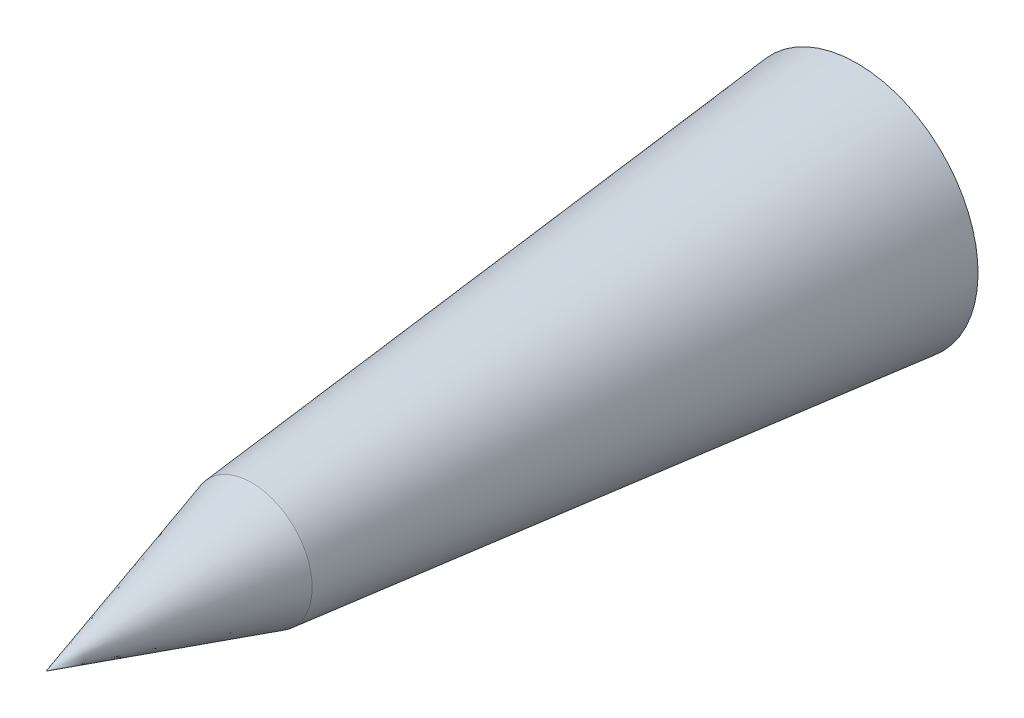
ISO-10303-21;
HEADER;
FILE_DESCRIPTION(('STEP AP214'),'2;1');
FILE_NAME('part.step','',(''),(''),'','','');
FILE_SCHEMA(('AUTOMOTIVE_DESIGN { 1 0 10303 214 1 1 1 1 }'));
ENDSEC;
DATA;
#1=APPLICATION_CONTEXT('core data for automotive mechanical design processes');
#2=APPLICATION_PROTOCOL_DEFINITION('international standard','automotive_design',2000,#1);
#3=PRODUCT_CONTEXT('',#1,'mechanical');
#4=PRODUCT('Part','Part','',(#3));
#5=PRODUCT_RELATED_PRODUCT_CATEGORY('part','',(#4));
#6=PRODUCT_DEFINITION_FORMATION('','',#4);
#7=PRODUCT_DEFINITION_CONTEXT('part definition',#1,'design');
#8=PRODUCT_DEFINITION('design','',#6,#7);
#9=PRODUCT_DEFINITION_SHAPE('','',#8);
#10=(LENGTH_UNIT() NAMED_UNIT(*) SI_UNIT(.MILLI.,.METRE.));
#11=(NAMED_UNIT(*) PLANE_ANGLE_UNIT() SI_UNIT($,.RADIAN.));
#12=(NAMED_UNIT(*) SI_UNIT($,.STERADIAN.) SOLID_ANGLE_UNIT());
#13=UNCERTAINTY_MEASURE_WITH_UNIT(LENGTH_MEASURE(1.E-05),#10,'distance_accuracy_value','');
#14=(GEOMETRIC_REPRESENTATION_CONTEXT(3) GLOBAL_UNCERTAINTY_ASSIGNED_CONTEXT((#13)) GLOBAL_UNIT_ASSIGNED_CONTEXT((#10,
#11,#12)) REPRESENTATION_CONTEXT('',''));
#15=CARTESIAN_POINT('',(0.,0.,0.));
#16=DIRECTION('',(0.,0.,1.));
#17=DIRECTION('',(1.,0.,0.));
#18=AXIS2_PLACEMENT_3D('',#15,#16,#17);
#19=CARTESIAN_POINT('',(0.,0.,254.));
#20=DIRECTION('',(0.,0.,-1.));
#21=DIRECTION('',(0.,1.,0.));
#22=AXIS2_PLACEMENT_3D('',#19,#20,#21);
#23=CONICAL_SURFACE('',#22,25.4,0.286286594457405);
#24=CARTESIAN_POINT('',(0.,0.,340.285040562383));
#25=VERTEX_POINT('',#24);
#26=VERTEX_LOOP('',#25);
#27=FACE_BOUND('',#26,.T.);
#28=CARTESIAN_POINT('',(0.,0.,254.));
#29=DIRECTION('',(0.,0.,-1.));
#30=DIRECTION('',(0.,1.,0.));
#31=AXIS2_PLACEMENT_3D('',#28,#29,#30);
#32=CIRCLE('',#31,25.4);
#33=CARTESIAN_POINT('',(0.,25.4,254.));
#34=VERTEX_POINT('',#33);
#35=EDGE_CURVE('E46',#34,#34,#32,.T.);
#36=ORIENTED_EDGE('',*,*,#35,.F.);
#37=EDGE_LOOP('',(#36));
#38=FACE_BOUND('',#37,.T.);
#39=ADVANCED_FACE('F40',(#27,#38),#23,.T.);
#40=CARTESIAN_POINT('',(0.,50.8,0.));
#41=DIRECTION('',(0.,0.,-1.));
#42=DIRECTION('',(0.,1.,0.));
#43=AXIS2_PLACEMENT_3D('',#40,#41,#42);
#44=PLANE('',#43);
#45=CARTESIAN_POINT('',(0.,0.,0.));
#46=DIRECTION('',(0.,0.,-1.));
#47=DIRECTION('',(0.,1.,0.));
#48=AXIS2_PLACEMENT_3D('',#45,#46,#47);
#49=CIRCLE('',#48,50.8);
#50=CARTESIAN_POINT('',(0.,50.8,0.));
#51=VERTEX_POINT('',#50);
#52=EDGE_CURVE('E11',#51,#51,#49,.T.);
#53=ORIENTED_EDGE('',*,*,#52,.T.);
#54=EDGE_LOOP('',(#53));
#55=FACE_BOUND('',#54,.T.);
#56=ADVANCED_FACE('F51',(#55),#44,.T.);
#57=CARTESIAN_POINT('',(0.,0.,0.));
#58=DIRECTION('',(0.,0.,-1.));
#59=DIRECTION('',(0.,1.,0.));
#60=AXIS2_PLACEMENT_3D('',#57,#58,#59);
#61=CONICAL_SURFACE('',#60,50.8,0.099668652491162);
#62=ORIENTED_EDGE('',*,*,#35,.T.);
#63=EDGE_LOOP('',(#62));
#64=FACE_BOUND('',#63,.T.);
#65=ORIENTED_EDGE('',*,*,#52,.F.);
#66=EDGE_LOOP('',(#65));
#67=FACE_BOUND('',#66,.T.);
#68=ADVANCED_FACE('F55',(#64,#67),#61,.T.);
#69=CLOSED_SHELL('',(#39,#56,#68));
#70=MANIFOLD_SOLID_BREP('B2',#69);
#71=ADVANCED_BREP_SHAPE_REPRESENTATION('',(#18,#70),#14);
#72=SHAPE_DEFINITION_REPRESENTATION(#9,#71);
ENDSEC;
END-ISO-10303-21;
